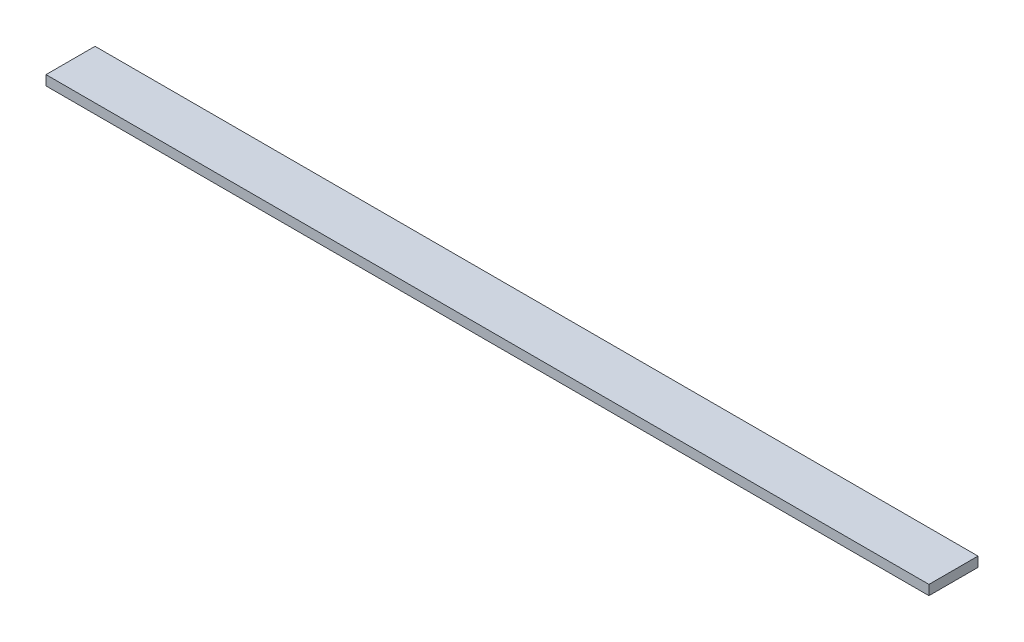
ISO-10303-21;
HEADER;
FILE_DESCRIPTION(('STEP AP214'),'2;1');
FILE_NAME('part.step','',(''),(''),'','','');
FILE_SCHEMA(('AUTOMOTIVE_DESIGN { 1 0 10303 214 1 1 1 1 }'));
ENDSEC;
DATA;
#1=APPLICATION_CONTEXT('core data for automotive mechanical design processes');
#2=APPLICATION_PROTOCOL_DEFINITION('international standard','automotive_design',2000,#1);
#3=PRODUCT_CONTEXT('',#1,'mechanical');
#4=PRODUCT('Part','Part','',(#3));
#5=PRODUCT_RELATED_PRODUCT_CATEGORY('part','',(#4));
#6=PRODUCT_DEFINITION_FORMATION('','',#4);
#7=PRODUCT_DEFINITION_CONTEXT('part definition',#1,'design');
#8=PRODUCT_DEFINITION('design','',#6,#7);
#9=PRODUCT_DEFINITION_SHAPE('','',#8);
#10=(LENGTH_UNIT() NAMED_UNIT(*) SI_UNIT(.MILLI.,.METRE.));
#11=(NAMED_UNIT(*) PLANE_ANGLE_UNIT() SI_UNIT($,.RADIAN.));
#12=(NAMED_UNIT(*) SI_UNIT($,.STERADIAN.) SOLID_ANGLE_UNIT());
#13=UNCERTAINTY_MEASURE_WITH_UNIT(LENGTH_MEASURE(1.E-05),#10,'distance_accuracy_value','');
#14=(GEOMETRIC_REPRESENTATION_CONTEXT(3) GLOBAL_UNCERTAINTY_ASSIGNED_CONTEXT((#13)) GLOBAL_UNIT_ASSIGNED_CONTEXT((#10,
#11,#12)) REPRESENTATION_CONTEXT('',''));
#15=CARTESIAN_POINT('',(0.,0.,0.));
#16=DIRECTION('',(0.,0.,1.));
#17=DIRECTION('',(1.,0.,0.));
#18=AXIS2_PLACEMENT_3D('',#15,#16,#17);
#19=CARTESIAN_POINT('',(119.916334661354,25.4,-173.423306772908));
#20=DIRECTION('',(-1.,0.,0.));
#21=DIRECTION('',(0.,0.,1.));
#22=AXIS2_PLACEMENT_3D('',#19,#20,#21);
#23=PLANE('',#22);
#24=DIRECTION('',(0.,1.,0.));
#25=VECTOR('',#24,1.);
#26=CARTESIAN_POINT('',(119.916334661355,116.478975515723,207.576693227092));
#27=LINE('',#26,#25);
#28=CARTESIAN_POINT('',(119.916334661355,154.94,207.576693227092));
#29=VERTEX_POINT('',#28);
#30=CARTESIAN_POINT('',(119.916334661355,160.02,207.576693227092));
#31=VERTEX_POINT('',#30);
#32=EDGE_CURVE('E11',#29,#31,#27,.T.);
#33=ORIENTED_EDGE('',*,*,#32,.F.);
#34=DIRECTION('',(0.,0.,-1.));
#35=VECTOR('',#34,1.);
#36=CARTESIAN_POINT('',(119.916334661355,154.94,-1.69309011255337E-13));
#37=LINE('',#36,#35);
#38=CARTESIAN_POINT('',(119.916334661355,154.94,182.176693227092));
#39=VERTEX_POINT('',#38);
#40=EDGE_CURVE('E111',#29,#39,#37,.T.);
#41=ORIENTED_EDGE('',*,*,#40,.T.);
#42=DIRECTION('',(0.,-1.,0.));
#43=VECTOR('',#42,1.);
#44=CARTESIAN_POINT('',(119.916334661355,160.02,182.176693227092));
#45=LINE('',#44,#43);
#46=CARTESIAN_POINT('',(119.916334661355,160.02,182.176693227092));
#47=VERTEX_POINT('',#46);
#48=EDGE_CURVE('E50',#47,#39,#45,.T.);
#49=ORIENTED_EDGE('',*,*,#48,.F.);
#50=DIRECTION('',(0.,0.,-1.));
#51=VECTOR('',#50,1.);
#52=CARTESIAN_POINT('',(119.916334661355,160.02,207.576693227092));
#53=LINE('',#52,#51);
#54=EDGE_CURVE('E86',#31,#47,#53,.T.);
#55=ORIENTED_EDGE('',*,*,#54,.F.);
#56=EDGE_LOOP('',(#33,#41,#49,#55));
#57=FACE_BOUND('',#56,.T.);
#58=ADVANCED_FACE('F41',(#57),#23,.F.);
#59=CARTESIAN_POINT('',(-261.083665338646,25.4,207.576693227092));
#60=DIRECTION('',(0.,0.,-1.));
#61=DIRECTION('',(-1.,0.,0.));
#62=AXIS2_PLACEMENT_3D('',#59,#60,#61);
#63=PLANE('',#62);
#64=DIRECTION('',(1.,0.,0.));
#65=VECTOR('',#64,1.);
#66=CARTESIAN_POINT('',(119.916334661355,160.02,207.576693227092));
#67=LINE('',#66,#65);
#68=CARTESIAN_POINT('',(-337.283665338646,160.02,207.576693227092));
#69=VERTEX_POINT('',#68);
#70=EDGE_CURVE('E89',#69,#31,#67,.T.);
#71=ORIENTED_EDGE('',*,*,#70,.F.);
#72=DIRECTION('',(0.,1.,0.));
#73=VECTOR('',#72,1.);
#74=CARTESIAN_POINT('',(-337.283665338646,74.6181474317232,207.576693227092));
#75=LINE('',#74,#73);
#76=CARTESIAN_POINT('',(-337.283665338646,154.94,207.576693227092));
#77=VERTEX_POINT('',#76);
#78=EDGE_CURVE('E99',#77,#69,#75,.T.);
#79=ORIENTED_EDGE('',*,*,#78,.F.);
#80=DIRECTION('',(-1.,0.,0.));
#81=VECTOR('',#80,1.);
#82=CARTESIAN_POINT('',(119.916334661355,154.94,207.576693227092));
#83=LINE('',#82,#81);
#84=EDGE_CURVE('E115',#29,#77,#83,.T.);
#85=ORIENTED_EDGE('',*,*,#84,.F.);
#86=ORIENTED_EDGE('',*,*,#32,.T.);
#87=EDGE_LOOP('',(#71,#79,#85,#86));
#88=FACE_BOUND('',#87,.T.);
#89=ADVANCED_FACE('F43',(#88),#63,.F.);
#90=CARTESIAN_POINT('',(119.916334661355,160.02,182.176693227092));
#91=DIRECTION('',(0.,0.,1.));
#92=DIRECTION('',(1.,0.,0.));
#93=AXIS2_PLACEMENT_3D('',#90,#91,#92);
#94=PLANE('',#93);
#95=ORIENTED_EDGE('',*,*,#48,.T.);
#96=DIRECTION('',(-1.,0.,0.));
#97=VECTOR('',#96,1.);
#98=CARTESIAN_POINT('',(119.916334661355,154.94,182.176693227092));
#99=LINE('',#98,#97);
#100=CARTESIAN_POINT('',(-337.283665338646,154.94,182.176693227092));
#101=VERTEX_POINT('',#100);
#102=EDGE_CURVE('E94',#39,#101,#99,.T.);
#103=ORIENTED_EDGE('',*,*,#102,.T.);
#104=DIRECTION('',(0.,1.,0.));
#105=VECTOR('',#104,1.);
#106=CARTESIAN_POINT('',(-337.283665338646,74.6181474317232,182.176693227092));
#107=LINE('',#106,#105);
#108=CARTESIAN_POINT('',(-337.283665338646,160.02,182.176693227092));
#109=VERTEX_POINT('',#108);
#110=EDGE_CURVE('E92',#101,#109,#107,.T.);
#111=ORIENTED_EDGE('',*,*,#110,.T.);
#112=DIRECTION('',(-1.,0.,0.));
#113=VECTOR('',#112,1.);
#114=CARTESIAN_POINT('',(119.916334661355,160.02,182.176693227092));
#115=LINE('',#114,#113);
#116=EDGE_CURVE('E63',#47,#109,#115,.T.);
#117=ORIENTED_EDGE('',*,*,#116,.F.);
#118=EDGE_LOOP('',(#95,#103,#111,#117));
#119=FACE_BOUND('',#118,.T.);
#120=ADVANCED_FACE('F93',(#119),#94,.F.);
#121=CARTESIAN_POINT('',(0.,160.02,0.));
#122=DIRECTION('',(0.,1.,0.));
#123=DIRECTION('',(0.,0.,1.));
#124=AXIS2_PLACEMENT_3D('',#121,#122,#123);
#125=PLANE('',#124);
#126=ORIENTED_EDGE('',*,*,#54,.T.);
#127=ORIENTED_EDGE('',*,*,#116,.T.);
#128=DIRECTION('',(0.,0.,1.));
#129=VECTOR('',#128,1.);
#130=CARTESIAN_POINT('',(-337.283665338646,160.02,182.176693227092));
#131=LINE('',#130,#129);
#132=EDGE_CURVE('E84',#109,#69,#131,.T.);
#133=ORIENTED_EDGE('',*,*,#132,.T.);
#134=ORIENTED_EDGE('',*,*,#70,.T.);
#135=EDGE_LOOP('',(#126,#127,#133,#134));
#136=FACE_BOUND('',#135,.T.);
#137=ADVANCED_FACE('F82',(#136),#125,.T.);
#138=CARTESIAN_POINT('',(119.916334661355,154.94,-1.69309011255337E-13));
#139=DIRECTION('',(0.,1.,0.));
#140=DIRECTION('',(0.,0.,1.));
#141=AXIS2_PLACEMENT_3D('',#138,#139,#140);
#142=PLANE('',#141);
#143=ORIENTED_EDGE('',*,*,#84,.T.);
#144=DIRECTION('',(0.,0.,-1.));
#145=VECTOR('',#144,1.);
#146=CARTESIAN_POINT('',(-337.283665338646,154.94,182.176693227092));
#147=LINE('',#146,#145);
#148=EDGE_CURVE('E108',#77,#101,#147,.T.);
#149=ORIENTED_EDGE('',*,*,#148,.T.);
#150=ORIENTED_EDGE('',*,*,#102,.F.);
#151=ORIENTED_EDGE('',*,*,#40,.F.);
#152=EDGE_LOOP('',(#143,#149,#150,#151));
#153=FACE_BOUND('',#152,.T.);
#154=ADVANCED_FACE('F126',(#153),#142,.F.);
#155=CARTESIAN_POINT('',(-337.283665338646,74.6181474317232,182.176693227092));
#156=DIRECTION('',(-1.,0.,0.));
#157=DIRECTION('',(0.,0.,1.));
#158=AXIS2_PLACEMENT_3D('',#155,#156,#157);
#159=PLANE('',#158);
#160=ORIENTED_EDGE('',*,*,#148,.F.);
#161=ORIENTED_EDGE('',*,*,#78,.T.);
#162=ORIENTED_EDGE('',*,*,#132,.F.);
#163=ORIENTED_EDGE('',*,*,#110,.F.);
#164=EDGE_LOOP('',(#160,#161,#162,#163));
#165=FACE_BOUND('',#164,.T.);
#166=ADVANCED_FACE('F102',(#165),#159,.T.);
#167=CLOSED_SHELL('',(#58,#89,#120,#137,#154,#166));
#168=MANIFOLD_SOLID_BREP('B2',#167);
#169=ADVANCED_BREP_SHAPE_REPRESENTATION('',(#18,#168),#14);
#170=SHAPE_DEFINITION_REPRESENTATION(#9,#169);
ENDSEC;
END-ISO-10303-21;
